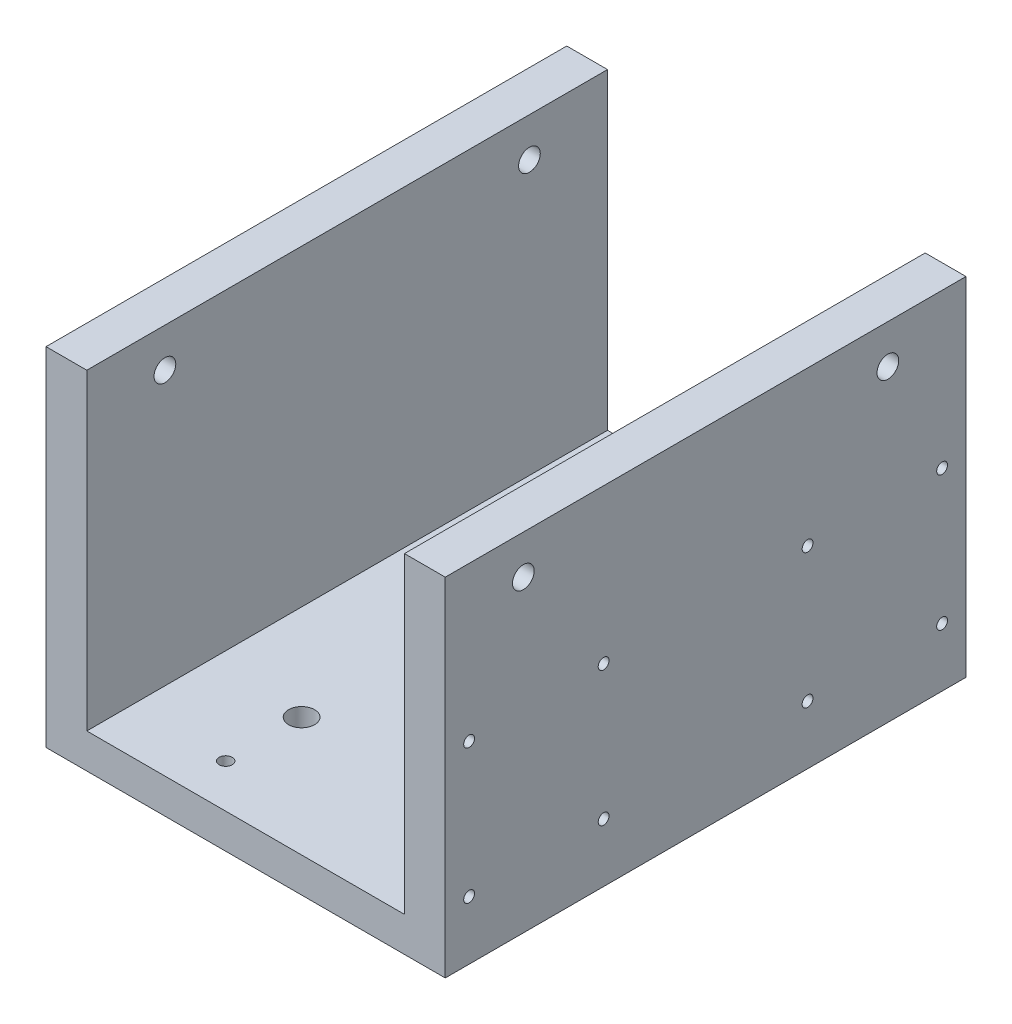
ISO-10303-21;
HEADER;
FILE_DESCRIPTION(('STEP AP214'),'2;1');
FILE_NAME('part.step','',(''),(''),'','','');
FILE_SCHEMA(('AUTOMOTIVE_DESIGN { 1 0 10303 214 1 1 1 1 }'));
ENDSEC;
DATA;
#1=APPLICATION_CONTEXT('core data for automotive mechanical design processes');
#2=APPLICATION_PROTOCOL_DEFINITION('international standard','automotive_design',2000,#1);
#3=PRODUCT_CONTEXT('',#1,'mechanical');
#4=PRODUCT('Part','Part','',(#3));
#5=PRODUCT_RELATED_PRODUCT_CATEGORY('part','',(#4));
#6=PRODUCT_DEFINITION_FORMATION('','',#4);
#7=PRODUCT_DEFINITION_CONTEXT('part definition',#1,'design');
#8=PRODUCT_DEFINITION('design','',#6,#7);
#9=PRODUCT_DEFINITION_SHAPE('','',#8);
#10=(LENGTH_UNIT() NAMED_UNIT(*) SI_UNIT(.MILLI.,.METRE.));
#11=(NAMED_UNIT(*) PLANE_ANGLE_UNIT() SI_UNIT($,.RADIAN.));
#12=(NAMED_UNIT(*) SI_UNIT($,.STERADIAN.) SOLID_ANGLE_UNIT());
#13=UNCERTAINTY_MEASURE_WITH_UNIT(LENGTH_MEASURE(1.E-05),#10,'distance_accuracy_value','');
#14=(GEOMETRIC_REPRESENTATION_CONTEXT(3) GLOBAL_UNCERTAINTY_ASSIGNED_CONTEXT((#13)) GLOBAL_UNIT_ASSIGNED_CONTEXT((#10,
#11,#12)) REPRESENTATION_CONTEXT('',''));
#15=CARTESIAN_POINT('',(0.,0.,0.));
#16=DIRECTION('',(0.,0.,1.));
#17=DIRECTION('',(1.,0.,0.));
#18=AXIS2_PLACEMENT_3D('',#15,#16,#17);
#19=CARTESIAN_POINT('',(0.,8.,0.));
#20=DIRECTION('',(0.,-1.,0.));
#21=DIRECTION('',(0.,0.,-1.));
#22=AXIS2_PLACEMENT_3D('',#19,#20,#21);
#23=PLANE('',#22);
#24=CARTESIAN_POINT('',(31.4,8.00000000000001,-110.));
#25=DIRECTION('',(0.,-1.,0.));
#26=DIRECTION('',(0.,0.,-1.));
#27=AXIS2_PLACEMENT_3D('',#24,#25,#26);
#28=CIRCLE('',#27,1.5);
#29=CARTESIAN_POINT('',(31.4,8.00000000000001,-111.5));
#30=VERTEX_POINT('',#29);
#31=EDGE_CURVE('E255',#30,#30,#28,.F.);
#32=ORIENTED_EDGE('',*,*,#31,.F.);
#33=EDGE_LOOP('',(#32));
#34=FACE_BOUND('',#33,.T.);
#35=CARTESIAN_POINT('',(31.4,8.00000000000001,-9.99999999999998));
#36=DIRECTION('',(0.,-1.,0.));
#37=DIRECTION('',(0.,0.,-1.));
#38=AXIS2_PLACEMENT_3D('',#35,#36,#37);
#39=CIRCLE('',#38,1.5);
#40=CARTESIAN_POINT('',(31.4,8.00000000000001,-11.5));
#41=VERTEX_POINT('',#40);
#42=EDGE_CURVE('E254',#41,#41,#39,.F.);
#43=ORIENTED_EDGE('',*,*,#42,.F.);
#44=EDGE_LOOP('',(#43));
#45=FACE_BOUND('',#44,.T.);
#46=CARTESIAN_POINT('',(31.4,8.00000000000001,-27.5));
#47=DIRECTION('',(0.,-1.,0.));
#48=DIRECTION('',(0.,0.,-1.));
#49=AXIS2_PLACEMENT_3D('',#46,#47,#48);
#50=CIRCLE('',#49,3.);
#51=CARTESIAN_POINT('',(31.4,8.00000000000001,-30.5));
#52=VERTEX_POINT('',#51);
#53=EDGE_CURVE('E248',#52,#52,#50,.F.);
#54=ORIENTED_EDGE('',*,*,#53,.F.);
#55=EDGE_LOOP('',(#54));
#56=FACE_BOUND('',#55,.T.);
#57=CARTESIAN_POINT('',(31.4,8.00000000000001,-92.5));
#58=DIRECTION('',(0.,-1.,0.));
#59=DIRECTION('',(0.,0.,-1.));
#60=AXIS2_PLACEMENT_3D('',#57,#58,#59);
#61=CIRCLE('',#60,3.);
#62=CARTESIAN_POINT('',(31.4,8.00000000000001,-95.5));
#63=VERTEX_POINT('',#62);
#64=EDGE_CURVE('E128',#63,#63,#61,.F.);
#65=ORIENTED_EDGE('',*,*,#64,.F.);
#66=EDGE_LOOP('',(#65));
#67=FACE_BOUND('',#66,.T.);
#68=DIRECTION('',(0.,0.,1.));
#69=VECTOR('',#68,1.);
#70=CARTESIAN_POINT('',(82.6,8.,-120.));
#71=LINE('',#70,#69);
#72=CARTESIAN_POINT('',(82.6,8.,-120.));
#73=VERTEX_POINT('',#72);
#74=CARTESIAN_POINT('',(82.6,8.,0.));
#75=VERTEX_POINT('',#74);
#76=EDGE_CURVE('E118',#73,#75,#71,.T.);
#77=ORIENTED_EDGE('',*,*,#76,.F.);
#78=DIRECTION('',(-1.,0.,0.));
#79=VECTOR('',#78,1.);
#80=CARTESIAN_POINT('',(0.,8.,-120.));
#81=LINE('',#80,#79);
#82=CARTESIAN_POINT('',(9.4,8.,-120.));
#83=VERTEX_POINT('',#82);
#84=EDGE_CURVE('E108',#73,#83,#81,.T.);
#85=ORIENTED_EDGE('',*,*,#84,.T.);
#86=DIRECTION('',(0.,0.,-1.));
#87=VECTOR('',#86,1.);
#88=CARTESIAN_POINT('',(9.4,8.,-120.));
#89=LINE('',#88,#87);
#90=CARTESIAN_POINT('',(9.40000000000001,8.,0.));
#91=VERTEX_POINT('',#90);
#92=EDGE_CURVE('E64',#91,#83,#89,.T.);
#93=ORIENTED_EDGE('',*,*,#92,.F.);
#94=DIRECTION('',(1.,0.,0.));
#95=VECTOR('',#94,1.);
#96=CARTESIAN_POINT('',(0.,8.,0.));
#97=LINE('',#96,#95);
#98=EDGE_CURVE('E59',#91,#75,#97,.T.);
#99=ORIENTED_EDGE('',*,*,#98,.T.);
#100=EDGE_LOOP('',(#77,#85,#93,#99));
#101=FACE_BOUND('',#100,.T.);
#102=ADVANCED_FACE('F42',(#34,#45,#56,#67,#101),#23,.F.);
#103=CARTESIAN_POINT('',(0.,8.,0.));
#104=DIRECTION('',(1.,0.,0.));
#105=DIRECTION('',(0.,0.,-1.));
#106=AXIS2_PLACEMENT_3D('',#103,#104,#105);
#107=PLANE('',#106);
#108=CARTESIAN_POINT('',(0.,71.,-18.));
#109=DIRECTION('',(1.,0.,0.));
#110=DIRECTION('',(0.,0.,-1.));
#111=AXIS2_PLACEMENT_3D('',#108,#109,#110);
#112=CIRCLE('',#111,2.5);
#113=CARTESIAN_POINT('',(0.,71.,-20.5));
#114=VERTEX_POINT('',#113);
#115=EDGE_CURVE('E178',#114,#114,#112,.T.);
#116=ORIENTED_EDGE('',*,*,#115,.T.);
#117=EDGE_LOOP('',(#116));
#118=FACE_BOUND('',#117,.T.);
#119=CARTESIAN_POINT('',(0.,71.,-102.));
#120=DIRECTION('',(1.,0.,0.));
#121=DIRECTION('',(0.,0.,-1.));
#122=AXIS2_PLACEMENT_3D('',#119,#120,#121);
#123=CIRCLE('',#122,2.50000000000001);
#124=CARTESIAN_POINT('',(0.,71.,-104.5));
#125=VERTEX_POINT('',#124);
#126=EDGE_CURVE('E194',#125,#125,#123,.T.);
#127=ORIENTED_EDGE('',*,*,#126,.T.);
#128=EDGE_LOOP('',(#127));
#129=FACE_BOUND('',#128,.T.);
#130=DIRECTION('',(0.,0.,1.));
#131=VECTOR('',#130,1.);
#132=CARTESIAN_POINT('',(0.,0.,0.));
#133=LINE('',#132,#131);
#134=CARTESIAN_POINT('',(0.,0.,-120.));
#135=VERTEX_POINT('',#134);
#136=CARTESIAN_POINT('',(0.,0.,0.));
#137=VERTEX_POINT('',#136);
#138=EDGE_CURVE('E159',#135,#137,#133,.T.);
#139=ORIENTED_EDGE('',*,*,#138,.T.);
#140=DIRECTION('',(0.,-1.,0.));
#141=VECTOR('',#140,1.);
#142=CARTESIAN_POINT('',(0.,8.,0.));
#143=LINE('',#142,#141);
#144=CARTESIAN_POINT('',(0.,80.,0.));
#145=VERTEX_POINT('',#144);
#146=EDGE_CURVE('E11',#145,#137,#143,.T.);
#147=ORIENTED_EDGE('',*,*,#146,.F.);
#148=DIRECTION('',(0.,0.,1.));
#149=VECTOR('',#148,1.);
#150=CARTESIAN_POINT('',(0.,80.,0.));
#151=LINE('',#150,#149);
#152=CARTESIAN_POINT('',(0.,80.,-120.));
#153=VERTEX_POINT('',#152);
#154=EDGE_CURVE('E144',#153,#145,#151,.T.);
#155=ORIENTED_EDGE('',*,*,#154,.F.);
#156=DIRECTION('',(0.,-1.,0.));
#157=VECTOR('',#156,1.);
#158=CARTESIAN_POINT('',(0.,8.,-120.));
#159=LINE('',#158,#157);
#160=EDGE_CURVE('E116',#153,#135,#159,.T.);
#161=ORIENTED_EDGE('',*,*,#160,.T.);
#162=EDGE_LOOP('',(#139,#147,#155,#161));
#163=FACE_BOUND('',#162,.T.);
#164=ADVANCED_FACE('F44',(#118,#129,#163),#107,.F.);
#165=CARTESIAN_POINT('',(0.,8.,0.));
#166=DIRECTION('',(0.,0.,-1.));
#167=DIRECTION('',(-1.,0.,0.));
#168=AXIS2_PLACEMENT_3D('',#165,#166,#167);
#169=PLANE('',#168);
#170=DIRECTION('',(1.,0.,0.));
#171=VECTOR('',#170,1.);
#172=CARTESIAN_POINT('',(0.,0.,0.));
#173=LINE('',#172,#171);
#174=CARTESIAN_POINT('',(92.,0.,0.));
#175=VERTEX_POINT('',#174);
#176=EDGE_CURVE('E164',#137,#175,#173,.T.);
#177=ORIENTED_EDGE('',*,*,#176,.T.);
#178=DIRECTION('',(0.,-1.,0.));
#179=VECTOR('',#178,1.);
#180=CARTESIAN_POINT('',(92.,8.,0.));
#181=LINE('',#180,#179);
#182=CARTESIAN_POINT('',(92.,80.,0.));
#183=VERTEX_POINT('',#182);
#184=EDGE_CURVE('E51',#183,#175,#181,.T.);
#185=ORIENTED_EDGE('',*,*,#184,.F.);
#186=DIRECTION('',(1.,0.,0.));
#187=VECTOR('',#186,1.);
#188=CARTESIAN_POINT('',(82.6,80.,0.));
#189=LINE('',#188,#187);
#190=CARTESIAN_POINT('',(82.6,80.,0.));
#191=VERTEX_POINT('',#190);
#192=EDGE_CURVE('E139',#191,#183,#189,.T.);
#193=ORIENTED_EDGE('',*,*,#192,.F.);
#194=DIRECTION('',(0.,-1.,0.));
#195=VECTOR('',#194,1.);
#196=CARTESIAN_POINT('',(82.6,80.,0.));
#197=LINE('',#196,#195);
#198=EDGE_CURVE('E127',#191,#75,#197,.T.);
#199=ORIENTED_EDGE('',*,*,#198,.T.);
#200=ORIENTED_EDGE('',*,*,#98,.F.);
#201=DIRECTION('',(0.,-1.,0.));
#202=VECTOR('',#201,1.);
#203=CARTESIAN_POINT('',(9.40000000000002,80.,0.));
#204=LINE('',#203,#202);
#205=CARTESIAN_POINT('',(9.40000000000002,80.,0.));
#206=VERTEX_POINT('',#205);
#207=EDGE_CURVE('E156',#206,#91,#204,.T.);
#208=ORIENTED_EDGE('',*,*,#207,.F.);
#209=DIRECTION('',(1.,0.,0.));
#210=VECTOR('',#209,1.);
#211=CARTESIAN_POINT('',(9.40000000000002,80.,0.));
#212=LINE('',#211,#210);
#213=EDGE_CURVE('E147',#145,#206,#212,.T.);
#214=ORIENTED_EDGE('',*,*,#213,.F.);
#215=ORIENTED_EDGE('',*,*,#146,.T.);
#216=EDGE_LOOP('',(#177,#185,#193,#199,#200,#208,#214,#215));
#217=FACE_BOUND('',#216,.T.);
#218=ADVANCED_FACE('F289',(#217),#169,.F.);
#219=CARTESIAN_POINT('',(92.,8.,0.));
#220=DIRECTION('',(-1.,0.,0.));
#221=DIRECTION('',(0.,0.,1.));
#222=AXIS2_PLACEMENT_3D('',#219,#220,#221);
#223=PLANE('',#222);
#224=CARTESIAN_POINT('',(92.,71.,-18.));
#225=DIRECTION('',(1.,0.,0.));
#226=DIRECTION('',(0.,0.,-1.));
#227=AXIS2_PLACEMENT_3D('',#224,#225,#226);
#228=CIRCLE('',#227,2.5);
#229=CARTESIAN_POINT('',(92.,71.,-20.5));
#230=VERTEX_POINT('',#229);
#231=EDGE_CURVE('E184',#230,#230,#228,.T.);
#232=ORIENTED_EDGE('',*,*,#231,.F.);
#233=EDGE_LOOP('',(#232));
#234=FACE_BOUND('',#233,.T.);
#235=CARTESIAN_POINT('',(92.,71.,-102.));
#236=DIRECTION('',(1.,0.,0.));
#237=DIRECTION('',(0.,0.,-1.));
#238=AXIS2_PLACEMENT_3D('',#235,#236,#237);
#239=CIRCLE('',#238,2.50000000000001);
#240=CARTESIAN_POINT('',(92.,71.,-104.5));
#241=VERTEX_POINT('',#240);
#242=EDGE_CURVE('E189',#241,#241,#239,.T.);
#243=ORIENTED_EDGE('',*,*,#242,.F.);
#244=EDGE_LOOP('',(#243));
#245=FACE_BOUND('',#244,.T.);
#246=CARTESIAN_POINT('',(92.,13.5,-83.5));
#247=DIRECTION('',(1.,0.,0.));
#248=DIRECTION('',(0.,0.,1.));
#249=AXIS2_PLACEMENT_3D('',#246,#247,#248);
#250=CIRCLE('',#249,1.25);
#251=CARTESIAN_POINT('',(92.,13.5,-82.25));
#252=VERTEX_POINT('',#251);
#253=EDGE_CURVE('E214',#252,#252,#250,.T.);
#254=ORIENTED_EDGE('',*,*,#253,.F.);
#255=EDGE_LOOP('',(#254));
#256=FACE_BOUND('',#255,.T.);
#257=CARTESIAN_POINT('',(92.,13.5,-36.5));
#258=DIRECTION('',(1.,0.,0.));
#259=DIRECTION('',(0.,0.,-1.));
#260=AXIS2_PLACEMENT_3D('',#257,#258,#259);
#261=CIRCLE('',#260,1.25);
#262=CARTESIAN_POINT('',(92.,13.5,-37.75));
#263=VERTEX_POINT('',#262);
#264=EDGE_CURVE('E219',#263,#263,#261,.T.);
#265=ORIENTED_EDGE('',*,*,#264,.F.);
#266=EDGE_LOOP('',(#265));
#267=FACE_BOUND('',#266,.T.);
#268=CARTESIAN_POINT('',(92.,13.5,-5.5));
#269=DIRECTION('',(1.,0.,0.));
#270=DIRECTION('',(0.,0.,-1.));
#271=AXIS2_PLACEMENT_3D('',#268,#269,#270);
#272=CIRCLE('',#271,1.25);
#273=CARTESIAN_POINT('',(92.,13.5,-6.75));
#274=VERTEX_POINT('',#273);
#275=EDGE_CURVE('E226',#274,#274,#272,.T.);
#276=ORIENTED_EDGE('',*,*,#275,.F.);
#277=EDGE_LOOP('',(#276));
#278=FACE_BOUND('',#277,.T.);
#279=CARTESIAN_POINT('',(92.,44.5,-36.5));
#280=DIRECTION('',(1.,0.,0.));
#281=DIRECTION('',(0.,0.,-1.));
#282=AXIS2_PLACEMENT_3D('',#279,#280,#281);
#283=CIRCLE('',#282,1.25);
#284=CARTESIAN_POINT('',(92.,44.5,-37.75));
#285=VERTEX_POINT('',#284);
#286=EDGE_CURVE('E231',#285,#285,#283,.T.);
#287=ORIENTED_EDGE('',*,*,#286,.F.);
#288=EDGE_LOOP('',(#287));
#289=FACE_BOUND('',#288,.T.);
#290=CARTESIAN_POINT('',(92.,44.5,-114.5));
#291=DIRECTION('',(1.,0.,0.));
#292=DIRECTION('',(0.,0.,1.));
#293=AXIS2_PLACEMENT_3D('',#290,#291,#292);
#294=CIRCLE('',#293,1.25);
#295=CARTESIAN_POINT('',(92.,44.5,-113.25));
#296=VERTEX_POINT('',#295);
#297=EDGE_CURVE('E200',#296,#296,#294,.T.);
#298=ORIENTED_EDGE('',*,*,#297,.F.);
#299=EDGE_LOOP('',(#298));
#300=FACE_BOUND('',#299,.T.);
#301=CARTESIAN_POINT('',(92.,44.5,-83.5));
#302=DIRECTION('',(1.,0.,0.));
#303=DIRECTION('',(0.,0.,1.));
#304=AXIS2_PLACEMENT_3D('',#301,#302,#303);
#305=CIRCLE('',#304,1.25);
#306=CARTESIAN_POINT('',(92.,44.5,-82.25));
#307=VERTEX_POINT('',#306);
#308=EDGE_CURVE('E206',#307,#307,#305,.T.);
#309=ORIENTED_EDGE('',*,*,#308,.F.);
#310=EDGE_LOOP('',(#309));
#311=FACE_BOUND('',#310,.T.);
#312=CARTESIAN_POINT('',(92.,13.5,-114.5));
#313=DIRECTION('',(1.,0.,0.));
#314=DIRECTION('',(0.,0.,1.));
#315=AXIS2_PLACEMENT_3D('',#312,#313,#314);
#316=CIRCLE('',#315,1.25000000000001);
#317=CARTESIAN_POINT('',(92.,13.5,-113.25));
#318=VERTEX_POINT('',#317);
#319=EDGE_CURVE('E207',#318,#318,#316,.T.);
#320=ORIENTED_EDGE('',*,*,#319,.F.);
#321=EDGE_LOOP('',(#320));
#322=FACE_BOUND('',#321,.T.);
#323=CARTESIAN_POINT('',(92.,44.5,-5.5));
#324=DIRECTION('',(1.,0.,0.));
#325=DIRECTION('',(0.,0.,-1.));
#326=AXIS2_PLACEMENT_3D('',#323,#324,#325);
#327=CIRCLE('',#326,1.25);
#328=CARTESIAN_POINT('',(92.,44.5,-6.75));
#329=VERTEX_POINT('',#328);
#330=EDGE_CURVE('E245',#329,#329,#327,.T.);
#331=ORIENTED_EDGE('',*,*,#330,.F.);
#332=EDGE_LOOP('',(#331));
#333=FACE_BOUND('',#332,.T.);
#334=DIRECTION('',(0.,0.,-1.));
#335=VECTOR('',#334,1.);
#336=CARTESIAN_POINT('',(92.,0.,0.));
#337=LINE('',#336,#335);
#338=CARTESIAN_POINT('',(92.,0.,-120.));
#339=VERTEX_POINT('',#338);
#340=EDGE_CURVE('E166',#175,#339,#337,.T.);
#341=ORIENTED_EDGE('',*,*,#340,.T.);
#342=DIRECTION('',(0.,-1.,0.));
#343=VECTOR('',#342,1.);
#344=CARTESIAN_POINT('',(92.,8.,-120.));
#345=LINE('',#344,#343);
#346=CARTESIAN_POINT('',(92.,80.,-120.));
#347=VERTEX_POINT('',#346);
#348=EDGE_CURVE('E171',#347,#339,#345,.T.);
#349=ORIENTED_EDGE('',*,*,#348,.F.);
#350=DIRECTION('',(0.,0.,-1.));
#351=VECTOR('',#350,1.);
#352=CARTESIAN_POINT('',(92.,80.,0.));
#353=LINE('',#352,#351);
#354=EDGE_CURVE('E130',#183,#347,#353,.T.);
#355=ORIENTED_EDGE('',*,*,#354,.F.);
#356=ORIENTED_EDGE('',*,*,#184,.T.);
#357=EDGE_LOOP('',(#341,#349,#355,#356));
#358=FACE_BOUND('',#357,.T.);
#359=ADVANCED_FACE('F295',(#234,#245,#256,#267,#278,#289,#300,#311,#322,#333,#358),#223,.F.);
#360=CARTESIAN_POINT('',(0.,8.,-120.));
#361=DIRECTION('',(0.,0.,1.));
#362=DIRECTION('',(1.,0.,0.));
#363=AXIS2_PLACEMENT_3D('',#360,#361,#362);
#364=PLANE('',#363);
#365=DIRECTION('',(-1.,0.,0.));
#366=VECTOR('',#365,1.);
#367=CARTESIAN_POINT('',(0.,0.,-120.));
#368=LINE('',#367,#366);
#369=EDGE_CURVE('E160',#339,#135,#368,.T.);
#370=ORIENTED_EDGE('',*,*,#369,.T.);
#371=ORIENTED_EDGE('',*,*,#160,.F.);
#372=DIRECTION('',(-1.,0.,0.));
#373=VECTOR('',#372,1.);
#374=CARTESIAN_POINT('',(0.,80.,-120.));
#375=LINE('',#374,#373);
#376=CARTESIAN_POINT('',(9.4,80.,-120.));
#377=VERTEX_POINT('',#376);
#378=EDGE_CURVE('E151',#377,#153,#375,.T.);
#379=ORIENTED_EDGE('',*,*,#378,.F.);
#380=DIRECTION('',(0.,-1.,0.));
#381=VECTOR('',#380,1.);
#382=CARTESIAN_POINT('',(9.4,80.,-120.));
#383=LINE('',#382,#381);
#384=EDGE_CURVE('E115',#377,#83,#383,.T.);
#385=ORIENTED_EDGE('',*,*,#384,.T.);
#386=ORIENTED_EDGE('',*,*,#84,.F.);
#387=DIRECTION('',(0.,-1.,0.));
#388=VECTOR('',#387,1.);
#389=CARTESIAN_POINT('',(82.6,80.,-120.));
#390=LINE('',#389,#388);
#391=CARTESIAN_POINT('',(82.6,80.,-120.));
#392=VERTEX_POINT('',#391);
#393=EDGE_CURVE('E112',#392,#73,#390,.T.);
#394=ORIENTED_EDGE('',*,*,#393,.F.);
#395=DIRECTION('',(-1.,0.,0.));
#396=VECTOR('',#395,1.);
#397=CARTESIAN_POINT('',(92.,80.,-120.));
#398=LINE('',#397,#396);
#399=EDGE_CURVE('E122',#347,#392,#398,.T.);
#400=ORIENTED_EDGE('',*,*,#399,.F.);
#401=ORIENTED_EDGE('',*,*,#348,.T.);
#402=EDGE_LOOP('',(#370,#371,#379,#385,#386,#394,#400,#401));
#403=FACE_BOUND('',#402,.T.);
#404=ADVANCED_FACE('F109',(#403),#364,.F.);
#405=CARTESIAN_POINT('',(0.,0.,0.));
#406=DIRECTION('',(0.,-1.,0.));
#407=DIRECTION('',(0.,0.,-1.));
#408=AXIS2_PLACEMENT_3D('',#405,#406,#407);
#409=PLANE('',#408);
#410=CARTESIAN_POINT('',(31.4,0.,-110.));
#411=DIRECTION('',(0.,-1.,0.));
#412=DIRECTION('',(0.,0.,-1.));
#413=AXIS2_PLACEMENT_3D('',#410,#411,#412);
#414=CIRCLE('',#413,1.5);
#415=CARTESIAN_POINT('',(31.4,0.,-111.5));
#416=VERTEX_POINT('',#415);
#417=EDGE_CURVE('E258',#416,#416,#414,.T.);
#418=ORIENTED_EDGE('',*,*,#417,.F.);
#419=EDGE_LOOP('',(#418));
#420=FACE_BOUND('',#419,.T.);
#421=CARTESIAN_POINT('',(31.4,0.,-9.99999999999998));
#422=DIRECTION('',(0.,-1.,0.));
#423=DIRECTION('',(0.,0.,1.));
#424=AXIS2_PLACEMENT_3D('',#421,#422,#423);
#425=CIRCLE('',#424,1.5);
#426=CARTESIAN_POINT('',(31.4,0.,-8.49999999999998));
#427=VERTEX_POINT('',#426);
#428=EDGE_CURVE('E259',#427,#427,#425,.T.);
#429=ORIENTED_EDGE('',*,*,#428,.F.);
#430=EDGE_LOOP('',(#429));
#431=FACE_BOUND('',#430,.T.);
#432=CARTESIAN_POINT('',(31.4,0.,-27.5));
#433=DIRECTION('',(0.,-1.,0.));
#434=DIRECTION('',(0.,0.,1.));
#435=AXIS2_PLACEMENT_3D('',#432,#433,#434);
#436=CIRCLE('',#435,3.);
#437=CARTESIAN_POINT('',(31.4,0.,-24.5));
#438=VERTEX_POINT('',#437);
#439=EDGE_CURVE('E251',#438,#438,#436,.T.);
#440=ORIENTED_EDGE('',*,*,#439,.F.);
#441=EDGE_LOOP('',(#440));
#442=FACE_BOUND('',#441,.T.);
#443=CARTESIAN_POINT('',(31.4,0.,-92.5));
#444=DIRECTION('',(0.,-1.,0.));
#445=DIRECTION('',(0.,0.,-1.));
#446=AXIS2_PLACEMENT_3D('',#443,#444,#445);
#447=CIRCLE('',#446,3.);
#448=CARTESIAN_POINT('',(31.4,0.,-95.5));
#449=VERTEX_POINT('',#448);
#450=EDGE_CURVE('E133',#449,#449,#447,.T.);
#451=ORIENTED_EDGE('',*,*,#450,.F.);
#452=EDGE_LOOP('',(#451));
#453=FACE_BOUND('',#452,.T.);
#454=ORIENTED_EDGE('',*,*,#138,.F.);
#455=ORIENTED_EDGE('',*,*,#369,.F.);
#456=ORIENTED_EDGE('',*,*,#340,.F.);
#457=ORIENTED_EDGE('',*,*,#176,.F.);
#458=EDGE_LOOP('',(#454,#455,#456,#457));
#459=FACE_BOUND('',#458,.T.);
#460=ADVANCED_FACE('F271',(#420,#431,#442,#453,#459),#409,.T.);
#461=CARTESIAN_POINT('',(9.4,80.,-120.));
#462=DIRECTION('',(-1.,0.,0.));
#463=DIRECTION('',(0.,0.,1.));
#464=AXIS2_PLACEMENT_3D('',#461,#462,#463);
#465=PLANE('',#464);
#466=CARTESIAN_POINT('',(9.40000000000001,71.,-18.));
#467=DIRECTION('',(-1.,0.,0.));
#468=DIRECTION('',(0.,0.,1.));
#469=AXIS2_PLACEMENT_3D('',#466,#467,#468);
#470=CIRCLE('',#469,2.5);
#471=CARTESIAN_POINT('',(9.40000000000001,71.,-15.5));
#472=VERTEX_POINT('',#471);
#473=EDGE_CURVE('E197',#472,#472,#470,.T.);
#474=ORIENTED_EDGE('',*,*,#473,.T.);
#475=EDGE_LOOP('',(#474));
#476=FACE_BOUND('',#475,.T.);
#477=CARTESIAN_POINT('',(9.4,71.,-102.));
#478=DIRECTION('',(-1.,0.,0.));
#479=DIRECTION('',(0.,0.,1.));
#480=AXIS2_PLACEMENT_3D('',#477,#478,#479);
#481=CIRCLE('',#480,2.50000000000001);
#482=CARTESIAN_POINT('',(9.4,71.,-99.5));
#483=VERTEX_POINT('',#482);
#484=EDGE_CURVE('E177',#483,#483,#481,.T.);
#485=ORIENTED_EDGE('',*,*,#484,.T.);
#486=EDGE_LOOP('',(#485));
#487=FACE_BOUND('',#486,.T.);
#488=ORIENTED_EDGE('',*,*,#92,.T.);
#489=ORIENTED_EDGE('',*,*,#384,.F.);
#490=DIRECTION('',(0.,0.,-1.));
#491=VECTOR('',#490,1.);
#492=CARTESIAN_POINT('',(9.4,80.,-120.));
#493=LINE('',#492,#491);
#494=EDGE_CURVE('E149',#206,#377,#493,.T.);
#495=ORIENTED_EDGE('',*,*,#494,.F.);
#496=ORIENTED_EDGE('',*,*,#207,.T.);
#497=EDGE_LOOP('',(#488,#489,#495,#496));
#498=FACE_BOUND('',#497,.T.);
#499=ADVANCED_FACE('F274',(#476,#487,#498),#465,.F.);
#500=CARTESIAN_POINT('',(0.,80.,0.));
#501=DIRECTION('',(0.,-1.,0.));
#502=DIRECTION('',(0.,0.,-1.));
#503=AXIS2_PLACEMENT_3D('',#500,#501,#502);
#504=PLANE('',#503);
#505=ORIENTED_EDGE('',*,*,#154,.T.);
#506=ORIENTED_EDGE('',*,*,#213,.T.);
#507=ORIENTED_EDGE('',*,*,#494,.T.);
#508=ORIENTED_EDGE('',*,*,#378,.T.);
#509=EDGE_LOOP('',(#505,#506,#507,#508));
#510=FACE_BOUND('',#509,.T.);
#511=ADVANCED_FACE('F284',(#510),#504,.F.);
#512=CARTESIAN_POINT('',(82.6,80.,-120.));
#513=DIRECTION('',(1.,0.,0.));
#514=DIRECTION('',(0.,0.,-1.));
#515=AXIS2_PLACEMENT_3D('',#512,#513,#514);
#516=PLANE('',#515);
#517=CARTESIAN_POINT('',(82.6,71.,-18.));
#518=DIRECTION('',(1.,0.,0.));
#519=DIRECTION('',(0.,0.,-1.));
#520=AXIS2_PLACEMENT_3D('',#517,#518,#519);
#521=CIRCLE('',#520,2.5);
#522=CARTESIAN_POINT('',(82.6,71.,-20.5));
#523=VERTEX_POINT('',#522);
#524=EDGE_CURVE('E46',#523,#523,#521,.T.);
#525=ORIENTED_EDGE('',*,*,#524,.T.);
#526=EDGE_LOOP('',(#525));
#527=FACE_BOUND('',#526,.T.);
#528=CARTESIAN_POINT('',(82.6,71.,-102.));
#529=DIRECTION('',(1.,0.,0.));
#530=DIRECTION('',(0.,0.,-1.));
#531=AXIS2_PLACEMENT_3D('',#528,#529,#530);
#532=CIRCLE('',#531,2.50000000000001);
#533=CARTESIAN_POINT('',(82.6,71.,-104.5));
#534=VERTEX_POINT('',#533);
#535=EDGE_CURVE('E175',#534,#534,#532,.T.);
#536=ORIENTED_EDGE('',*,*,#535,.T.);
#537=EDGE_LOOP('',(#536));
#538=FACE_BOUND('',#537,.T.);
#539=CARTESIAN_POINT('',(82.6,13.5,-83.5));
#540=DIRECTION('',(1.,0.,0.));
#541=DIRECTION('',(0.,0.,-1.));
#542=AXIS2_PLACEMENT_3D('',#539,#540,#541);
#543=CIRCLE('',#542,1.25);
#544=CARTESIAN_POINT('',(82.6,13.5,-84.75));
#545=VERTEX_POINT('',#544);
#546=EDGE_CURVE('E223',#545,#545,#543,.F.);
#547=ORIENTED_EDGE('',*,*,#546,.F.);
#548=EDGE_LOOP('',(#547));
#549=FACE_BOUND('',#548,.T.);
#550=CARTESIAN_POINT('',(82.6,13.5,-36.5));
#551=DIRECTION('',(1.,0.,0.));
#552=DIRECTION('',(0.,0.,-1.));
#553=AXIS2_PLACEMENT_3D('',#550,#551,#552);
#554=CIRCLE('',#553,1.25);
#555=CARTESIAN_POINT('',(82.6,13.5,-37.75));
#556=VERTEX_POINT('',#555);
#557=EDGE_CURVE('E222',#556,#556,#554,.F.);
#558=ORIENTED_EDGE('',*,*,#557,.F.);
#559=EDGE_LOOP('',(#558));
#560=FACE_BOUND('',#559,.T.);
#561=CARTESIAN_POINT('',(82.6,13.5,-5.5));
#562=DIRECTION('',(1.,0.,0.));
#563=DIRECTION('',(0.,0.,-1.));
#564=AXIS2_PLACEMENT_3D('',#561,#562,#563);
#565=CIRCLE('',#564,1.25);
#566=CARTESIAN_POINT('',(82.6,13.5,-6.75));
#567=VERTEX_POINT('',#566);
#568=EDGE_CURVE('E235',#567,#567,#565,.F.);
#569=ORIENTED_EDGE('',*,*,#568,.F.);
#570=EDGE_LOOP('',(#569));
#571=FACE_BOUND('',#570,.T.);
#572=CARTESIAN_POINT('',(82.6,44.5,-36.5));
#573=DIRECTION('',(1.,0.,0.));
#574=DIRECTION('',(0.,0.,-1.));
#575=AXIS2_PLACEMENT_3D('',#572,#573,#574);
#576=CIRCLE('',#575,1.25);
#577=CARTESIAN_POINT('',(82.6,44.5,-37.75));
#578=VERTEX_POINT('',#577);
#579=EDGE_CURVE('E234',#578,#578,#576,.F.);
#580=ORIENTED_EDGE('',*,*,#579,.F.);
#581=EDGE_LOOP('',(#580));
#582=FACE_BOUND('',#581,.T.);
#583=CARTESIAN_POINT('',(82.6,44.5,-114.5));
#584=DIRECTION('',(1.,0.,0.));
#585=DIRECTION('',(0.,0.,-1.));
#586=AXIS2_PLACEMENT_3D('',#583,#584,#585);
#587=CIRCLE('',#586,1.25);
#588=CARTESIAN_POINT('',(82.6,44.5,-115.75));
#589=VERTEX_POINT('',#588);
#590=EDGE_CURVE('E203',#589,#589,#587,.F.);
#591=ORIENTED_EDGE('',*,*,#590,.F.);
#592=EDGE_LOOP('',(#591));
#593=FACE_BOUND('',#592,.T.);
#594=CARTESIAN_POINT('',(82.6,44.5,-83.5));
#595=DIRECTION('',(1.,0.,0.));
#596=DIRECTION('',(0.,0.,-1.));
#597=AXIS2_PLACEMENT_3D('',#594,#595,#596);
#598=CIRCLE('',#597,1.25);
#599=CARTESIAN_POINT('',(82.6,44.5,-84.75));
#600=VERTEX_POINT('',#599);
#601=EDGE_CURVE('E211',#600,#600,#598,.F.);
#602=ORIENTED_EDGE('',*,*,#601,.F.);
#603=EDGE_LOOP('',(#602));
#604=FACE_BOUND('',#603,.T.);
#605=CARTESIAN_POINT('',(82.6,13.5,-114.5));
#606=DIRECTION('',(1.,0.,0.));
#607=DIRECTION('',(0.,0.,-1.));
#608=AXIS2_PLACEMENT_3D('',#605,#606,#607);
#609=CIRCLE('',#608,1.25000000000001);
#610=CARTESIAN_POINT('',(82.6,13.5,-115.75));
#611=VERTEX_POINT('',#610);
#612=EDGE_CURVE('E210',#611,#611,#609,.F.);
#613=ORIENTED_EDGE('',*,*,#612,.F.);
#614=EDGE_LOOP('',(#613));
#615=FACE_BOUND('',#614,.T.);
#616=CARTESIAN_POINT('',(82.6,44.5,-5.5));
#617=DIRECTION('',(1.,0.,0.));
#618=DIRECTION('',(0.,0.,-1.));
#619=AXIS2_PLACEMENT_3D('',#616,#617,#618);
#620=CIRCLE('',#619,1.25);
#621=CARTESIAN_POINT('',(82.6,44.5,-6.75));
#622=VERTEX_POINT('',#621);
#623=EDGE_CURVE('E238',#622,#622,#620,.F.);
#624=ORIENTED_EDGE('',*,*,#623,.F.);
#625=EDGE_LOOP('',(#624));
#626=FACE_BOUND('',#625,.T.);
#627=ORIENTED_EDGE('',*,*,#76,.T.);
#628=ORIENTED_EDGE('',*,*,#198,.F.);
#629=DIRECTION('',(0.,0.,1.));
#630=VECTOR('',#629,1.);
#631=CARTESIAN_POINT('',(82.6,80.,-120.));
#632=LINE('',#631,#630);
#633=EDGE_CURVE('E125',#392,#191,#632,.T.);
#634=ORIENTED_EDGE('',*,*,#633,.F.);
#635=ORIENTED_EDGE('',*,*,#393,.T.);
#636=EDGE_LOOP('',(#627,#628,#634,#635));
#637=FACE_BOUND('',#636,.T.);
#638=ADVANCED_FACE('F124',(#527,#538,#549,#560,#571,#582,#593,#604,#615,#626,#637),#516,.F.);
#639=CARTESIAN_POINT('',(0.,80.,0.));
#640=DIRECTION('',(0.,1.,0.));
#641=DIRECTION('',(0.,0.,1.));
#642=AXIS2_PLACEMENT_3D('',#639,#640,#641);
#643=PLANE('',#642);
#644=ORIENTED_EDGE('',*,*,#399,.T.);
#645=ORIENTED_EDGE('',*,*,#633,.T.);
#646=ORIENTED_EDGE('',*,*,#192,.T.);
#647=ORIENTED_EDGE('',*,*,#354,.T.);
#648=EDGE_LOOP('',(#644,#645,#646,#647));
#649=FACE_BOUND('',#648,.T.);
#650=ADVANCED_FACE('F293',(#649),#643,.T.);
#651=CARTESIAN_POINT('',(31.4,80.001,-92.5));
#652=DIRECTION('',(0.,-1.,0.));
#653=DIRECTION('',(0.,0.,-1.));
#654=AXIS2_PLACEMENT_3D('',#651,#652,#653);
#655=CYLINDRICAL_SURFACE('',#654,3.);
#656=ORIENTED_EDGE('',*,*,#450,.T.);
#657=EDGE_LOOP('',(#656));
#658=FACE_BOUND('',#657,.T.);
#659=ORIENTED_EDGE('',*,*,#64,.T.);
#660=EDGE_LOOP('',(#659));
#661=FACE_BOUND('',#660,.T.);
#662=ADVANCED_FACE('F268',(#658,#661),#655,.F.);
#663=CARTESIAN_POINT('',(31.4,80.001,-27.5));
#664=DIRECTION('',(0.,-1.,0.));
#665=DIRECTION('',(0.,0.,-1.));
#666=AXIS2_PLACEMENT_3D('',#663,#664,#665);
#667=CYLINDRICAL_SURFACE('',#666,3.);
#668=ORIENTED_EDGE('',*,*,#439,.T.);
#669=EDGE_LOOP('',(#668));
#670=FACE_BOUND('',#669,.T.);
#671=ORIENTED_EDGE('',*,*,#53,.T.);
#672=EDGE_LOOP('',(#671));
#673=FACE_BOUND('',#672,.T.);
#674=ADVANCED_FACE('F328',(#670,#673),#667,.F.);
#675=CARTESIAN_POINT('',(31.4,80.001,-9.99999999999998));
#676=DIRECTION('',(0.,-1.,0.));
#677=DIRECTION('',(0.,0.,-1.));
#678=AXIS2_PLACEMENT_3D('',#675,#676,#677);
#679=CYLINDRICAL_SURFACE('',#678,1.5);
#680=ORIENTED_EDGE('',*,*,#428,.T.);
#681=EDGE_LOOP('',(#680));
#682=FACE_BOUND('',#681,.T.);
#683=ORIENTED_EDGE('',*,*,#42,.T.);
#684=EDGE_LOOP('',(#683));
#685=FACE_BOUND('',#684,.T.);
#686=ADVANCED_FACE('F329',(#682,#685),#679,.F.);
#687=CARTESIAN_POINT('',(31.4,80.001,-110.));
#688=DIRECTION('',(0.,-1.,0.));
#689=DIRECTION('',(0.,0.,-1.));
#690=AXIS2_PLACEMENT_3D('',#687,#688,#689);
#691=CYLINDRICAL_SURFACE('',#690,1.5);
#692=ORIENTED_EDGE('',*,*,#417,.T.);
#693=EDGE_LOOP('',(#692));
#694=FACE_BOUND('',#693,.T.);
#695=ORIENTED_EDGE('',*,*,#31,.T.);
#696=EDGE_LOOP('',(#695));
#697=FACE_BOUND('',#696,.T.);
#698=ADVANCED_FACE('F332',(#694,#697),#691,.F.);
#699=CARTESIAN_POINT('',(-0.001000000000001,44.5,-5.5));
#700=DIRECTION('',(1.,0.,0.));
#701=DIRECTION('',(0.,0.,-1.));
#702=AXIS2_PLACEMENT_3D('',#699,#700,#701);
#703=CYLINDRICAL_SURFACE('',#702,1.25);
#704=ORIENTED_EDGE('',*,*,#330,.T.);
#705=EDGE_LOOP('',(#704));
#706=FACE_BOUND('',#705,.T.);
#707=ORIENTED_EDGE('',*,*,#623,.T.);
#708=EDGE_LOOP('',(#707));
#709=FACE_BOUND('',#708,.T.);
#710=ADVANCED_FACE('F336',(#706,#709),#703,.F.);
#711=CARTESIAN_POINT('',(-0.001000000000001,13.5,-114.5));
#712=DIRECTION('',(1.,0.,0.));
#713=DIRECTION('',(0.,0.,-1.));
#714=AXIS2_PLACEMENT_3D('',#711,#712,#713);
#715=CYLINDRICAL_SURFACE('',#714,1.25000000000001);
#716=ORIENTED_EDGE('',*,*,#319,.T.);
#717=EDGE_LOOP('',(#716));
#718=FACE_BOUND('',#717,.T.);
#719=ORIENTED_EDGE('',*,*,#612,.T.);
#720=EDGE_LOOP('',(#719));
#721=FACE_BOUND('',#720,.T.);
#722=ADVANCED_FACE('F343',(#718,#721),#715,.F.);
#723=CARTESIAN_POINT('',(-0.001000000000001,44.5,-83.5));
#724=DIRECTION('',(1.,0.,0.));
#725=DIRECTION('',(0.,0.,-1.));
#726=AXIS2_PLACEMENT_3D('',#723,#724,#725);
#727=CYLINDRICAL_SURFACE('',#726,1.25);
#728=ORIENTED_EDGE('',*,*,#308,.T.);
#729=EDGE_LOOP('',(#728));
#730=FACE_BOUND('',#729,.T.);
#731=ORIENTED_EDGE('',*,*,#601,.T.);
#732=EDGE_LOOP('',(#731));
#733=FACE_BOUND('',#732,.T.);
#734=ADVANCED_FACE('F363',(#730,#733),#727,.F.);
#735=CARTESIAN_POINT('',(-0.001000000000001,44.5,-114.5));
#736=DIRECTION('',(1.,0.,0.));
#737=DIRECTION('',(0.,0.,-1.));
#738=AXIS2_PLACEMENT_3D('',#735,#736,#737);
#739=CYLINDRICAL_SURFACE('',#738,1.25);
#740=ORIENTED_EDGE('',*,*,#297,.T.);
#741=EDGE_LOOP('',(#740));
#742=FACE_BOUND('',#741,.T.);
#743=ORIENTED_EDGE('',*,*,#590,.T.);
#744=EDGE_LOOP('',(#743));
#745=FACE_BOUND('',#744,.T.);
#746=ADVANCED_FACE('F353',(#742,#745),#739,.F.);
#747=CARTESIAN_POINT('',(-0.001000000000001,44.5,-36.5));
#748=DIRECTION('',(1.,0.,0.));
#749=DIRECTION('',(0.,0.,-1.));
#750=AXIS2_PLACEMENT_3D('',#747,#748,#749);
#751=CYLINDRICAL_SURFACE('',#750,1.25);
#752=ORIENTED_EDGE('',*,*,#286,.T.);
#753=EDGE_LOOP('',(#752));
#754=FACE_BOUND('',#753,.T.);
#755=ORIENTED_EDGE('',*,*,#579,.T.);
#756=EDGE_LOOP('',(#755));
#757=FACE_BOUND('',#756,.T.);
#758=ADVANCED_FACE('F349',(#754,#757),#751,.F.);
#759=CARTESIAN_POINT('',(-0.001000000000001,13.5,-5.5));
#760=DIRECTION('',(1.,0.,0.));
#761=DIRECTION('',(0.,0.,-1.));
#762=AXIS2_PLACEMENT_3D('',#759,#760,#761);
#763=CYLINDRICAL_SURFACE('',#762,1.25);
#764=ORIENTED_EDGE('',*,*,#275,.T.);
#765=EDGE_LOOP('',(#764));
#766=FACE_BOUND('',#765,.T.);
#767=ORIENTED_EDGE('',*,*,#568,.T.);
#768=EDGE_LOOP('',(#767));
#769=FACE_BOUND('',#768,.T.);
#770=ADVANCED_FACE('F345',(#766,#769),#763,.F.);
#771=CARTESIAN_POINT('',(-0.001000000000001,13.5,-36.5));
#772=DIRECTION('',(1.,0.,0.));
#773=DIRECTION('',(0.,0.,-1.));
#774=AXIS2_PLACEMENT_3D('',#771,#772,#773);
#775=CYLINDRICAL_SURFACE('',#774,1.25);
#776=ORIENTED_EDGE('',*,*,#264,.T.);
#777=EDGE_LOOP('',(#776));
#778=FACE_BOUND('',#777,.T.);
#779=ORIENTED_EDGE('',*,*,#557,.T.);
#780=EDGE_LOOP('',(#779));
#781=FACE_BOUND('',#780,.T.);
#782=ADVANCED_FACE('F348',(#778,#781),#775,.F.);
#783=CARTESIAN_POINT('',(-0.001000000000001,13.5,-83.5));
#784=DIRECTION('',(1.,0.,0.));
#785=DIRECTION('',(0.,0.,-1.));
#786=AXIS2_PLACEMENT_3D('',#783,#784,#785);
#787=CYLINDRICAL_SURFACE('',#786,1.25);
#788=ORIENTED_EDGE('',*,*,#253,.T.);
#789=EDGE_LOOP('',(#788));
#790=FACE_BOUND('',#789,.T.);
#791=ORIENTED_EDGE('',*,*,#546,.T.);
#792=EDGE_LOOP('',(#791));
#793=FACE_BOUND('',#792,.T.);
#794=ADVANCED_FACE('F355',(#790,#793),#787,.F.);
#795=CARTESIAN_POINT('',(0.,71.,-102.));
#796=DIRECTION('',(1.,0.,0.));
#797=DIRECTION('',(0.,0.,-1.));
#798=AXIS2_PLACEMENT_3D('',#795,#796,#797);
#799=CYLINDRICAL_SURFACE('',#798,2.50000000000001);
#800=ORIENTED_EDGE('',*,*,#242,.T.);
#801=EDGE_LOOP('',(#800));
#802=FACE_BOUND('',#801,.T.);
#803=ORIENTED_EDGE('',*,*,#535,.F.);
#804=EDGE_LOOP('',(#803));
#805=FACE_BOUND('',#804,.T.);
#806=ADVANCED_FACE('F358',(#802,#805),#799,.F.);
#807=CARTESIAN_POINT('',(0.,71.,-18.));
#808=DIRECTION('',(1.,0.,0.));
#809=DIRECTION('',(0.,0.,-1.));
#810=AXIS2_PLACEMENT_3D('',#807,#808,#809);
#811=CYLINDRICAL_SURFACE('',#810,2.5);
#812=ORIENTED_EDGE('',*,*,#231,.T.);
#813=EDGE_LOOP('',(#812));
#814=FACE_BOUND('',#813,.T.);
#815=ORIENTED_EDGE('',*,*,#524,.F.);
#816=EDGE_LOOP('',(#815));
#817=FACE_BOUND('',#816,.T.);
#818=ADVANCED_FACE('F377',(#814,#817),#811,.F.);
#819=ORIENTED_EDGE('',*,*,#126,.F.);
#820=EDGE_LOOP('',(#819));
#821=FACE_BOUND('',#820,.T.);
#822=ORIENTED_EDGE('',*,*,#484,.F.);
#823=EDGE_LOOP('',(#822));
#824=FACE_BOUND('',#823,.T.);
#825=ADVANCED_FACE('F373',(#821,#824),#799,.F.);
#826=ORIENTED_EDGE('',*,*,#115,.F.);
#827=EDGE_LOOP('',(#826));
#828=FACE_BOUND('',#827,.T.);
#829=ORIENTED_EDGE('',*,*,#473,.F.);
#830=EDGE_LOOP('',(#829));
#831=FACE_BOUND('',#830,.T.);
#832=ADVANCED_FACE('F376',(#828,#831),#811,.F.);
#833=CLOSED_SHELL('',(#102,#164,#218,#359,#404,#460,#499,#511,#638,#650,#662,#674,#686,#698,
#710,#722,#734,#746,#758,#770,#782,#794,#806,#818,#825,#832));
#834=MANIFOLD_SOLID_BREP('B2',#833);
#835=ADVANCED_BREP_SHAPE_REPRESENTATION('',(#18,#834),#14);
#836=SHAPE_DEFINITION_REPRESENTATION(#9,#835);
ENDSEC;
END-ISO-10303-21;
